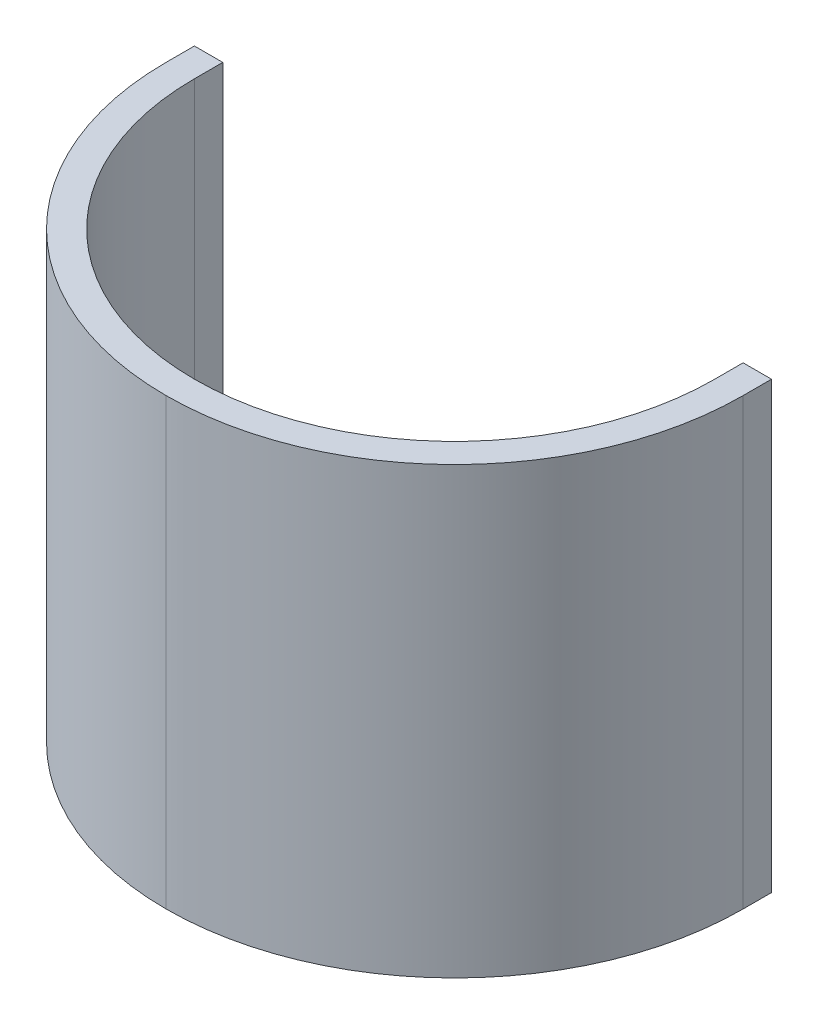
ISO-10303-21;
HEADER;
FILE_DESCRIPTION(('STEP AP214'),'2;1');
FILE_NAME('part.step','',(''),(''),'','','');
FILE_SCHEMA(('AUTOMOTIVE_DESIGN { 1 0 10303 214 1 1 1 1 }'));
ENDSEC;
DATA;
#1=APPLICATION_CONTEXT('core data for automotive mechanical design processes');
#2=APPLICATION_PROTOCOL_DEFINITION('international standard','automotive_design',2000,#1);
#3=PRODUCT_CONTEXT('',#1,'mechanical');
#4=PRODUCT('Part','Part','',(#3));
#5=PRODUCT_RELATED_PRODUCT_CATEGORY('part','',(#4));
#6=PRODUCT_DEFINITION_FORMATION('','',#4);
#7=PRODUCT_DEFINITION_CONTEXT('part definition',#1,'design');
#8=PRODUCT_DEFINITION('design','',#6,#7);
#9=PRODUCT_DEFINITION_SHAPE('','',#8);
#10=(LENGTH_UNIT() NAMED_UNIT(*) SI_UNIT(.MILLI.,.METRE.));
#11=(NAMED_UNIT(*) PLANE_ANGLE_UNIT() SI_UNIT($,.RADIAN.));
#12=(NAMED_UNIT(*) SI_UNIT($,.STERADIAN.) SOLID_ANGLE_UNIT());
#13=UNCERTAINTY_MEASURE_WITH_UNIT(LENGTH_MEASURE(1.E-05),#10,'distance_accuracy_value','');
#14=(GEOMETRIC_REPRESENTATION_CONTEXT(3) GLOBAL_UNCERTAINTY_ASSIGNED_CONTEXT((#13)) GLOBAL_UNIT_ASSIGNED_CONTEXT((#10,
#11,#12)) REPRESENTATION_CONTEXT('',''));
#15=CARTESIAN_POINT('',(0.,0.,0.));
#16=DIRECTION('',(0.,0.,1.));
#17=DIRECTION('',(1.,0.,0.));
#18=AXIS2_PLACEMENT_3D('',#15,#16,#17);
#19=CARTESIAN_POINT('',(-30.5,50.,-16.75));
#20=DIRECTION('',(0.,0.,1.));
#21=DIRECTION('',(1.,0.,0.));
#22=AXIS2_PLACEMENT_3D('',#19,#20,#21);
#23=PLANE('',#22);
#24=DIRECTION('',(0.,-1.,0.));
#25=VECTOR('',#24,1.);
#26=CARTESIAN_POINT('',(-30.5,50.,-16.75));
#27=LINE('',#26,#25);
#28=CARTESIAN_POINT('',(-30.5,47.,-16.75));
#29=VERTEX_POINT('',#28);
#30=CARTESIAN_POINT('',(-30.5,0.,-16.75));
#31=VERTEX_POINT('',#30);
#32=EDGE_CURVE('E168',#29,#31,#27,.T.);
#33=ORIENTED_EDGE('',*,*,#32,.F.);
#34=DIRECTION('',(-1.,0.,0.));
#35=VECTOR('',#34,1.);
#36=CARTESIAN_POINT('',(30.5,47.,-16.75));
#37=LINE('',#36,#35);
#38=CARTESIAN_POINT('',(-27.5,47.,-16.75));
#39=VERTEX_POINT('',#38);
#40=EDGE_CURVE('E160',#39,#29,#37,.T.);
#41=ORIENTED_EDGE('',*,*,#40,.F.);
#42=DIRECTION('',(0.,1.,0.));
#43=VECTOR('',#42,1.);
#44=CARTESIAN_POINT('',(-27.5,3.,-16.75));
#45=LINE('',#44,#43);
#46=CARTESIAN_POINT('',(-27.5,3.,-16.75));
#47=VERTEX_POINT('',#46);
#48=EDGE_CURVE('E199',#47,#39,#45,.T.);
#49=ORIENTED_EDGE('',*,*,#48,.F.);
#50=DIRECTION('',(-1.,0.,0.));
#51=VECTOR('',#50,1.);
#52=CARTESIAN_POINT('',(27.5,3.,-16.75));
#53=LINE('',#52,#51);
#54=CARTESIAN_POINT('',(-25.4803846124818,3.,-16.75));
#55=VERTEX_POINT('',#54);
#56=EDGE_CURVE('E262',#55,#47,#53,.T.);
#57=ORIENTED_EDGE('',*,*,#56,.F.);
#58=DIRECTION('',(0.,-1.,0.));
#59=VECTOR('',#58,1.);
#60=CARTESIAN_POINT('',(-25.4803846124818,50.,-16.75));
#61=LINE('',#60,#59);
#62=CARTESIAN_POINT('',(-25.4803846124818,0.,-16.75));
#63=VERTEX_POINT('',#62);
#64=EDGE_CURVE('E11',#55,#63,#61,.T.);
#65=ORIENTED_EDGE('',*,*,#64,.T.);
#66=DIRECTION('',(-1.,0.,0.));
#67=VECTOR('',#66,1.);
#68=CARTESIAN_POINT('',(-30.5,0.,-16.75));
#69=LINE('',#68,#67);
#70=EDGE_CURVE('E250',#63,#31,#69,.T.);
#71=ORIENTED_EDGE('',*,*,#70,.T.);
#72=EDGE_LOOP('',(#33,#41,#49,#57,#65,#71));
#73=FACE_BOUND('',#72,.T.);
#74=ADVANCED_FACE('F38',(#73),#23,.F.);
#75=CARTESIAN_POINT('',(30.5,50.,16.75));
#76=DIRECTION('',(-1.,0.,0.));
#77=DIRECTION('',(0.,0.,1.));
#78=AXIS2_PLACEMENT_3D('',#75,#76,#77);
#79=PLANE('',#78);
#80=DIRECTION('',(0.,-1.,0.));
#81=VECTOR('',#80,1.);
#82=CARTESIAN_POINT('',(30.5,50.,-16.75));
#83=LINE('',#82,#81);
#84=CARTESIAN_POINT('',(30.5,47.,-16.75));
#85=VERTEX_POINT('',#84);
#86=CARTESIAN_POINT('',(30.5,0.,-16.75));
#87=VERTEX_POINT('',#86);
#88=EDGE_CURVE('E154',#85,#87,#83,.T.);
#89=ORIENTED_EDGE('',*,*,#88,.F.);
#90=DIRECTION('',(0.,0.,-1.));
#91=VECTOR('',#90,1.);
#92=CARTESIAN_POINT('',(30.5,47.,383.25));
#93=LINE('',#92,#91);
#94=CARTESIAN_POINT('',(30.5,47.,-13.75));
#95=VERTEX_POINT('',#94);
#96=EDGE_CURVE('E138',#95,#85,#93,.T.);
#97=ORIENTED_EDGE('',*,*,#96,.F.);
#98=DIRECTION('',(0.,-1.,0.));
#99=VECTOR('',#98,1.);
#100=CARTESIAN_POINT('',(30.5,50.,-13.75));
#101=LINE('',#100,#99);
#102=CARTESIAN_POINT('',(30.5,0.,-13.75));
#103=VERTEX_POINT('',#102);
#104=EDGE_CURVE('E210',#95,#103,#101,.T.);
#105=ORIENTED_EDGE('',*,*,#104,.T.);
#106=DIRECTION('',(0.,0.,-1.));
#107=VECTOR('',#106,1.);
#108=CARTESIAN_POINT('',(30.5,0.,16.75));
#109=LINE('',#108,#107);
#110=EDGE_CURVE('E164',#103,#87,#109,.T.);
#111=ORIENTED_EDGE('',*,*,#110,.T.);
#112=EDGE_LOOP('',(#89,#97,#105,#111));
#113=FACE_BOUND('',#112,.T.);
#114=ADVANCED_FACE('F162',(#113),#79,.F.);
#115=DIRECTION('',(0.,-1.,0.));
#116=VECTOR('',#115,1.);
#117=CARTESIAN_POINT('',(27.5,3.,-16.75));
#118=LINE('',#117,#116);
#119=CARTESIAN_POINT('',(27.5,47.,-16.75));
#120=VERTEX_POINT('',#119);
#121=CARTESIAN_POINT('',(27.5,3.,-16.75));
#122=VERTEX_POINT('',#121);
#123=EDGE_CURVE('E158',#120,#122,#118,.T.);
#124=ORIENTED_EDGE('',*,*,#123,.F.);
#125=EDGE_CURVE('E141',#85,#120,#37,.T.);
#126=ORIENTED_EDGE('',*,*,#125,.F.);
#127=ORIENTED_EDGE('',*,*,#88,.T.);
#128=CARTESIAN_POINT('',(25.4803846124818,0.,-16.75));
#129=VERTEX_POINT('',#128);
#130=EDGE_CURVE('E243',#87,#129,#69,.T.);
#131=ORIENTED_EDGE('',*,*,#130,.T.);
#132=DIRECTION('',(0.,-1.,0.));
#133=VECTOR('',#132,1.);
#134=CARTESIAN_POINT('',(25.4803846124818,50.,-16.75));
#135=LINE('',#134,#133);
#136=CARTESIAN_POINT('',(25.4803846124818,3.,-16.75));
#137=VERTEX_POINT('',#136);
#138=EDGE_CURVE('E221',#129,#137,#135,.F.);
#139=ORIENTED_EDGE('',*,*,#138,.T.);
#140=EDGE_CURVE('E257',#122,#137,#53,.T.);
#141=ORIENTED_EDGE('',*,*,#140,.F.);
#142=EDGE_LOOP('',(#124,#126,#127,#131,#139,#141));
#143=FACE_BOUND('',#142,.T.);
#144=ADVANCED_FACE('F152',(#143),#23,.F.);
#145=CARTESIAN_POINT('',(-30.5,50.,16.75));
#146=DIRECTION('',(1.,0.,0.));
#147=DIRECTION('',(0.,0.,-1.));
#148=AXIS2_PLACEMENT_3D('',#145,#146,#147);
#149=PLANE('',#148);
#150=DIRECTION('',(0.,-1.,0.));
#151=VECTOR('',#150,1.);
#152=CARTESIAN_POINT('',(-30.5,50.,-13.75));
#153=LINE('',#152,#151);
#154=CARTESIAN_POINT('',(-30.5,0.,-13.75));
#155=VERTEX_POINT('',#154);
#156=CARTESIAN_POINT('',(-30.5,47.,-13.75));
#157=VERTEX_POINT('',#156);
#158=EDGE_CURVE('E206',#155,#157,#153,.F.);
#159=ORIENTED_EDGE('',*,*,#158,.T.);
#160=DIRECTION('',(0.,0.,-1.));
#161=VECTOR('',#160,1.);
#162=CARTESIAN_POINT('',(-30.5,47.,383.25));
#163=LINE('',#162,#161);
#164=EDGE_CURVE('E54',#157,#29,#163,.T.);
#165=ORIENTED_EDGE('',*,*,#164,.T.);
#166=ORIENTED_EDGE('',*,*,#32,.T.);
#167=DIRECTION('',(0.,0.,1.));
#168=VECTOR('',#167,1.);
#169=CARTESIAN_POINT('',(-30.5,0.,16.75));
#170=LINE('',#169,#168);
#171=EDGE_CURVE('E174',#31,#155,#170,.T.);
#172=ORIENTED_EDGE('',*,*,#171,.T.);
#173=EDGE_LOOP('',(#159,#165,#166,#172));
#174=FACE_BOUND('',#173,.T.);
#175=ADVANCED_FACE('F296',(#174),#149,.F.);
#176=CARTESIAN_POINT('',(0.,0.,0.));
#177=DIRECTION('',(0.,-1.,0.));
#178=DIRECTION('',(0.,0.,-1.));
#179=AXIS2_PLACEMENT_3D('',#176,#177,#178);
#180=PLANE('',#179);
#181=CARTESIAN_POINT('',(0.,0.,-13.7500000000001));
#182=DIRECTION('',(0.,-1.,0.));
#183=DIRECTION('',(0.,0.,-1.));
#184=AXIS2_PLACEMENT_3D('',#181,#182,#183);
#185=CIRCLE('',#184,23.5);
#186=CARTESIAN_POINT('',(23.4819230742479,0.,-14.671568627451));
#187=VERTEX_POINT('',#186);
#188=CARTESIAN_POINT('',(-23.481923074248,0.,-14.671568627451));
#189=VERTEX_POINT('',#188);
#190=EDGE_CURVE('E217',#187,#189,#185,.T.);
#191=ORIENTED_EDGE('',*,*,#190,.F.);
#192=CARTESIAN_POINT('',(25.4803846124818,0.,-14.75));
#193=DIRECTION('',(0.,-1.,0.));
#194=DIRECTION('',(0.,0.,-1.));
#195=AXIS2_PLACEMENT_3D('',#192,#193,#194);
#196=CIRCLE('',#195,2.);
#197=EDGE_CURVE('E47',#187,#129,#196,.T.);
#198=ORIENTED_EDGE('',*,*,#197,.T.);
#199=ORIENTED_EDGE('',*,*,#130,.F.);
#200=ORIENTED_EDGE('',*,*,#110,.F.);
#201=CARTESIAN_POINT('',(0.,0.,-13.75));
#202=DIRECTION('',(0.,-1.,0.));
#203=DIRECTION('',(0.,0.,-1.));
#204=AXIS2_PLACEMENT_3D('',#201,#202,#203);
#205=CIRCLE('',#204,30.5);
#206=CARTESIAN_POINT('',(0.,0.,16.75));
#207=VERTEX_POINT('',#206);
#208=EDGE_CURVE('E194',#103,#207,#205,.T.);
#209=ORIENTED_EDGE('',*,*,#208,.T.);
#210=CARTESIAN_POINT('',(0.,0.,-13.75));
#211=DIRECTION('',(0.,-1.,0.));
#212=DIRECTION('',(0.,0.,-1.));
#213=AXIS2_PLACEMENT_3D('',#210,#211,#212);
#214=CIRCLE('',#213,30.5);
#215=EDGE_CURVE('E203',#207,#155,#214,.T.);
#216=ORIENTED_EDGE('',*,*,#215,.T.);
#217=ORIENTED_EDGE('',*,*,#171,.F.);
#218=ORIENTED_EDGE('',*,*,#70,.F.);
#219=CARTESIAN_POINT('',(-25.4803846124818,0.,-14.75));
#220=DIRECTION('',(0.,-1.,0.));
#221=DIRECTION('',(0.,0.,-1.));
#222=AXIS2_PLACEMENT_3D('',#219,#220,#221);
#223=CIRCLE('',#222,2.);
#224=EDGE_CURVE('E62',#63,#189,#223,.T.);
#225=ORIENTED_EDGE('',*,*,#224,.T.);
#226=EDGE_LOOP('',(#191,#198,#199,#200,#209,#216,#217,#218,#225));
#227=FACE_BOUND('',#226,.T.);
#228=ADVANCED_FACE('F242',(#227),#180,.T.);
#229=CARTESIAN_POINT('',(-27.5,3.,13.75));
#230=DIRECTION('',(-1.,0.,0.));
#231=DIRECTION('',(0.,0.,1.));
#232=AXIS2_PLACEMENT_3D('',#229,#230,#231);
#233=PLANE('',#232);
#234=DIRECTION('',(0.,0.,-1.));
#235=VECTOR('',#234,1.);
#236=CARTESIAN_POINT('',(-27.5,47.,13.75));
#237=LINE('',#236,#235);
#238=CARTESIAN_POINT('',(-27.5,47.,-13.75));
#239=VERTEX_POINT('',#238);
#240=EDGE_CURVE('E275',#239,#39,#237,.T.);
#241=ORIENTED_EDGE('',*,*,#240,.F.);
#242=DIRECTION('',(0.,1.,0.));
#243=VECTOR('',#242,1.);
#244=CARTESIAN_POINT('',(-27.5,3.,-13.75));
#245=LINE('',#244,#243);
#246=CARTESIAN_POINT('',(-27.5,3.,-13.75));
#247=VERTEX_POINT('',#246);
#248=EDGE_CURVE('E180',#239,#247,#245,.F.);
#249=ORIENTED_EDGE('',*,*,#248,.T.);
#250=DIRECTION('',(0.,0.,-1.));
#251=VECTOR('',#250,1.);
#252=CARTESIAN_POINT('',(-27.5,3.,13.75));
#253=LINE('',#252,#251);
#254=EDGE_CURVE('E279',#247,#47,#253,.T.);
#255=ORIENTED_EDGE('',*,*,#254,.T.);
#256=ORIENTED_EDGE('',*,*,#48,.T.);
#257=EDGE_LOOP('',(#241,#249,#255,#256));
#258=FACE_BOUND('',#257,.T.);
#259=ADVANCED_FACE('F313',(#258),#233,.F.);
#260=CARTESIAN_POINT('',(27.5,3.,13.75));
#261=DIRECTION('',(0.,-1.,0.));
#262=DIRECTION('',(0.,0.,-1.));
#263=AXIS2_PLACEMENT_3D('',#260,#261,#262);
#264=PLANE('',#263);
#265=ORIENTED_EDGE('',*,*,#140,.T.);
#266=CARTESIAN_POINT('',(25.4803846124818,3.,-14.75));
#267=DIRECTION('',(0.,-1.,0.));
#268=DIRECTION('',(0.,0.,-1.));
#269=AXIS2_PLACEMENT_3D('',#266,#267,#268);
#270=CIRCLE('',#269,2.);
#271=CARTESIAN_POINT('',(23.4819230742479,3.,-14.671568627451));
#272=VERTEX_POINT('',#271);
#273=EDGE_CURVE('E228',#137,#272,#270,.F.);
#274=ORIENTED_EDGE('',*,*,#273,.T.);
#275=CARTESIAN_POINT('',(0.,3.,-13.7500000000001));
#276=DIRECTION('',(0.,-1.,0.));
#277=DIRECTION('',(0.,0.,-1.));
#278=AXIS2_PLACEMENT_3D('',#275,#276,#277);
#279=CIRCLE('',#278,23.5);
#280=CARTESIAN_POINT('',(-23.481923074248,3.,-14.671568627451));
#281=VERTEX_POINT('',#280);
#282=EDGE_CURVE('E213',#272,#281,#279,.T.);
#283=ORIENTED_EDGE('',*,*,#282,.T.);
#284=CARTESIAN_POINT('',(-25.4803846124818,3.,-14.75));
#285=DIRECTION('',(0.,-1.,0.));
#286=DIRECTION('',(0.,0.,-1.));
#287=AXIS2_PLACEMENT_3D('',#284,#285,#286);
#288=CIRCLE('',#287,2.);
#289=EDGE_CURVE('E225',#281,#55,#288,.F.);
#290=ORIENTED_EDGE('',*,*,#289,.T.);
#291=ORIENTED_EDGE('',*,*,#56,.T.);
#292=ORIENTED_EDGE('',*,*,#254,.F.);
#293=CARTESIAN_POINT('',(0.,3.,-13.75));
#294=DIRECTION('',(0.,-1.,0.));
#295=DIRECTION('',(0.,0.,-1.));
#296=AXIS2_PLACEMENT_3D('',#293,#294,#295);
#297=CIRCLE('',#296,27.5);
#298=CARTESIAN_POINT('',(0.,3.,13.75));
#299=VERTEX_POINT('',#298);
#300=EDGE_CURVE('E187',#247,#299,#297,.F.);
#301=ORIENTED_EDGE('',*,*,#300,.T.);
#302=CARTESIAN_POINT('',(0.,3.,-13.75));
#303=DIRECTION('',(0.,-1.,0.));
#304=DIRECTION('',(0.,0.,-1.));
#305=AXIS2_PLACEMENT_3D('',#302,#303,#304);
#306=CIRCLE('',#305,27.5);
#307=CARTESIAN_POINT('',(27.5,3.,-13.75));
#308=VERTEX_POINT('',#307);
#309=EDGE_CURVE('E184',#299,#308,#306,.F.);
#310=ORIENTED_EDGE('',*,*,#309,.T.);
#311=DIRECTION('',(0.,0.,-1.));
#312=VECTOR('',#311,1.);
#313=CARTESIAN_POINT('',(27.5,3.,13.75));
#314=LINE('',#313,#312);
#315=EDGE_CURVE('E282',#308,#122,#314,.T.);
#316=ORIENTED_EDGE('',*,*,#315,.T.);
#317=EDGE_LOOP('',(#265,#274,#283,#290,#291,#292,#301,#310,#316));
#318=FACE_BOUND('',#317,.T.);
#319=ADVANCED_FACE('F255',(#318),#264,.F.);
#320=CARTESIAN_POINT('',(27.5,3.,13.75));
#321=DIRECTION('',(1.,0.,0.));
#322=DIRECTION('',(0.,0.,-1.));
#323=AXIS2_PLACEMENT_3D('',#320,#321,#322);
#324=PLANE('',#323);
#325=ORIENTED_EDGE('',*,*,#315,.F.);
#326=DIRECTION('',(0.,-1.,0.));
#327=VECTOR('',#326,1.);
#328=CARTESIAN_POINT('',(27.5,47.,-13.75));
#329=LINE('',#328,#327);
#330=CARTESIAN_POINT('',(27.5,47.,-13.75));
#331=VERTEX_POINT('',#330);
#332=EDGE_CURVE('E190',#308,#331,#329,.F.);
#333=ORIENTED_EDGE('',*,*,#332,.T.);
#334=DIRECTION('',(0.,0.,-1.));
#335=VECTOR('',#334,1.);
#336=CARTESIAN_POINT('',(27.5,47.,13.75));
#337=LINE('',#336,#335);
#338=EDGE_CURVE('E285',#331,#120,#337,.T.);
#339=ORIENTED_EDGE('',*,*,#338,.T.);
#340=ORIENTED_EDGE('',*,*,#123,.T.);
#341=EDGE_LOOP('',(#325,#333,#339,#340));
#342=FACE_BOUND('',#341,.T.);
#343=ADVANCED_FACE('F326',(#342),#324,.F.);
#344=CARTESIAN_POINT('',(0.,0.,-13.75));
#345=DIRECTION('',(0.,1.,0.));
#346=DIRECTION('',(0.,0.,1.));
#347=AXIS2_PLACEMENT_3D('',#344,#345,#346);
#348=CYLINDRICAL_SURFACE('',#347,27.5);
#349=ORIENTED_EDGE('',*,*,#332,.F.);
#350=ORIENTED_EDGE('',*,*,#309,.F.);
#351=DIRECTION('',(0.,-1.,0.));
#352=VECTOR('',#351,1.);
#353=CARTESIAN_POINT('',(0.,3.,13.75));
#354=LINE('',#353,#352);
#355=CARTESIAN_POINT('',(0.,47.,13.75));
#356=VERTEX_POINT('',#355);
#357=EDGE_CURVE('E195',#356,#299,#354,.T.);
#358=ORIENTED_EDGE('',*,*,#357,.F.);
#359=CARTESIAN_POINT('',(0.,47.,-13.75));
#360=DIRECTION('',(0.,1.,0.));
#361=DIRECTION('',(0.,0.,1.));
#362=AXIS2_PLACEMENT_3D('',#359,#360,#361);
#363=CIRCLE('',#362,27.5);
#364=EDGE_CURVE('E167',#331,#356,#363,.F.);
#365=ORIENTED_EDGE('',*,*,#364,.F.);
#366=EDGE_LOOP('',(#349,#350,#358,#365));
#367=FACE_BOUND('',#366,.T.);
#368=ADVANCED_FACE('F321',(#367),#348,.F.);
#369=CARTESIAN_POINT('',(0.,0.,-13.75));
#370=DIRECTION('',(0.,-1.,0.));
#371=DIRECTION('',(0.,0.,-1.));
#372=AXIS2_PLACEMENT_3D('',#369,#370,#371);
#373=CYLINDRICAL_SURFACE('',#372,27.5);
#374=ORIENTED_EDGE('',*,*,#300,.F.);
#375=ORIENTED_EDGE('',*,*,#248,.F.);
#376=CARTESIAN_POINT('',(0.,47.,-13.75));
#377=DIRECTION('',(0.,1.,0.));
#378=DIRECTION('',(0.,0.,1.));
#379=AXIS2_PLACEMENT_3D('',#376,#377,#378);
#380=CIRCLE('',#379,27.5);
#381=EDGE_CURVE('E172',#356,#239,#380,.F.);
#382=ORIENTED_EDGE('',*,*,#381,.F.);
#383=ORIENTED_EDGE('',*,*,#357,.T.);
#384=EDGE_LOOP('',(#374,#375,#382,#383));
#385=FACE_BOUND('',#384,.T.);
#386=ADVANCED_FACE('F324',(#385),#373,.F.);
#387=CARTESIAN_POINT('',(0.,50.,-13.75));
#388=DIRECTION('',(0.,-1.,0.));
#389=DIRECTION('',(0.,0.,-1.));
#390=AXIS2_PLACEMENT_3D('',#387,#388,#389);
#391=CYLINDRICAL_SURFACE('',#390,30.5);
#392=CARTESIAN_POINT('',(0.,47.,-13.75));
#393=DIRECTION('',(0.,-1.,0.));
#394=DIRECTION('',(0.,0.,-1.));
#395=AXIS2_PLACEMENT_3D('',#392,#393,#394);
#396=CIRCLE('',#395,30.5);
#397=CARTESIAN_POINT('',(0.,47.,16.75));
#398=VERTEX_POINT('',#397);
#399=EDGE_CURVE('E144',#398,#95,#396,.F.);
#400=ORIENTED_EDGE('',*,*,#399,.F.);
#401=DIRECTION('',(0.,-1.,0.));
#402=VECTOR('',#401,1.);
#403=CARTESIAN_POINT('',(0.,50.,16.75));
#404=LINE('',#403,#402);
#405=EDGE_CURVE('E200',#207,#398,#404,.F.);
#406=ORIENTED_EDGE('',*,*,#405,.F.);
#407=ORIENTED_EDGE('',*,*,#208,.F.);
#408=ORIENTED_EDGE('',*,*,#104,.F.);
#409=EDGE_LOOP('',(#400,#406,#407,#408));
#410=FACE_BOUND('',#409,.T.);
#411=ADVANCED_FACE('F382',(#410),#391,.T.);
#412=CARTESIAN_POINT('',(0.,50.,-13.75));
#413=DIRECTION('',(0.,-1.,0.));
#414=DIRECTION('',(0.,0.,-1.));
#415=AXIS2_PLACEMENT_3D('',#412,#413,#414);
#416=CYLINDRICAL_SURFACE('',#415,30.5);
#417=CARTESIAN_POINT('',(0.,47.,-13.75));
#418=DIRECTION('',(0.,-1.,0.));
#419=DIRECTION('',(0.,0.,-1.));
#420=AXIS2_PLACEMENT_3D('',#417,#418,#419);
#421=CIRCLE('',#420,30.5);
#422=EDGE_CURVE('E300',#157,#398,#421,.F.);
#423=ORIENTED_EDGE('',*,*,#422,.F.);
#424=ORIENTED_EDGE('',*,*,#158,.F.);
#425=ORIENTED_EDGE('',*,*,#215,.F.);
#426=ORIENTED_EDGE('',*,*,#405,.T.);
#427=EDGE_LOOP('',(#423,#424,#425,#426));
#428=FACE_BOUND('',#427,.T.);
#429=ADVANCED_FACE('F299',(#428),#416,.T.);
#430=CARTESIAN_POINT('',(0.,30.5,-13.7500000000001));
#431=DIRECTION('',(0.,-1.,0.));
#432=DIRECTION('',(0.,0.,-1.));
#433=AXIS2_PLACEMENT_3D('',#430,#431,#432);
#434=CYLINDRICAL_SURFACE('',#433,23.5);
#435=ORIENTED_EDGE('',*,*,#282,.F.);
#436=DIRECTION('',(0.,-1.,0.));
#437=VECTOR('',#436,1.);
#438=CARTESIAN_POINT('',(23.4819230742479,30.5,-14.671568627451));
#439=LINE('',#438,#437);
#440=EDGE_CURVE('E234',#272,#187,#439,.T.);
#441=ORIENTED_EDGE('',*,*,#440,.T.);
#442=ORIENTED_EDGE('',*,*,#190,.T.);
#443=DIRECTION('',(0.,-1.,0.));
#444=VECTOR('',#443,1.);
#445=CARTESIAN_POINT('',(-23.481923074248,30.5,-14.671568627451));
#446=LINE('',#445,#444);
#447=EDGE_CURVE('E231',#189,#281,#446,.F.);
#448=ORIENTED_EDGE('',*,*,#447,.T.);
#449=EDGE_LOOP('',(#435,#441,#442,#448));
#450=FACE_BOUND('',#449,.T.);
#451=ADVANCED_FACE('F259',(#450),#434,.F.);
#452=CARTESIAN_POINT('',(25.4803846124818,30.5,-14.75));
#453=DIRECTION('',(0.,-1.,0.));
#454=DIRECTION('',(0.,0.,-1.));
#455=AXIS2_PLACEMENT_3D('',#452,#453,#454);
#456=CYLINDRICAL_SURFACE('',#455,2.);
#457=ORIENTED_EDGE('',*,*,#197,.F.);
#458=ORIENTED_EDGE('',*,*,#440,.F.);
#459=ORIENTED_EDGE('',*,*,#273,.F.);
#460=ORIENTED_EDGE('',*,*,#138,.F.);
#461=EDGE_LOOP('',(#457,#458,#459,#460));
#462=FACE_BOUND('',#461,.T.);
#463=ADVANCED_FACE('F252',(#462),#456,.T.);
#464=CARTESIAN_POINT('',(-25.4803846124818,30.5,-14.75));
#465=DIRECTION('',(0.,-1.,0.));
#466=DIRECTION('',(0.,0.,-1.));
#467=AXIS2_PLACEMENT_3D('',#464,#465,#466);
#468=CYLINDRICAL_SURFACE('',#467,2.);
#469=ORIENTED_EDGE('',*,*,#289,.F.);
#470=ORIENTED_EDGE('',*,*,#447,.F.);
#471=ORIENTED_EDGE('',*,*,#224,.F.);
#472=ORIENTED_EDGE('',*,*,#64,.F.);
#473=EDGE_LOOP('',(#469,#470,#471,#472));
#474=FACE_BOUND('',#473,.T.);
#475=ADVANCED_FACE('F40',(#474),#468,.T.);
#476=CARTESIAN_POINT('',(30.5,47.,383.25));
#477=DIRECTION('',(0.,-1.,0.));
#478=DIRECTION('',(0.,0.,-1.));
#479=AXIS2_PLACEMENT_3D('',#476,#477,#478);
#480=PLANE('',#479);
#481=ORIENTED_EDGE('',*,*,#40,.T.);
#482=ORIENTED_EDGE('',*,*,#164,.F.);
#483=ORIENTED_EDGE('',*,*,#422,.T.);
#484=ORIENTED_EDGE('',*,*,#399,.T.);
#485=ORIENTED_EDGE('',*,*,#96,.T.);
#486=ORIENTED_EDGE('',*,*,#125,.T.);
#487=ORIENTED_EDGE('',*,*,#338,.F.);
#488=ORIENTED_EDGE('',*,*,#364,.T.);
#489=ORIENTED_EDGE('',*,*,#381,.T.);
#490=ORIENTED_EDGE('',*,*,#240,.T.);
#491=EDGE_LOOP('',(#481,#482,#483,#484,#485,#486,#487,#488,#489,#490));
#492=FACE_BOUND('',#491,.T.);
#493=ADVANCED_FACE('F140',(#492),#480,.F.);
#494=CLOSED_SHELL('',(#74,#114,#144,#175,#228,#259,#319,#343,#368,#386,#411,#429,#451,#463,#475,#493));
#495=MANIFOLD_SOLID_BREP('B2',#494);
#496=ADVANCED_BREP_SHAPE_REPRESENTATION('',(#18,#495),#14);
#497=SHAPE_DEFINITION_REPRESENTATION(#9,#496);
ENDSEC;
END-ISO-10303-21;
